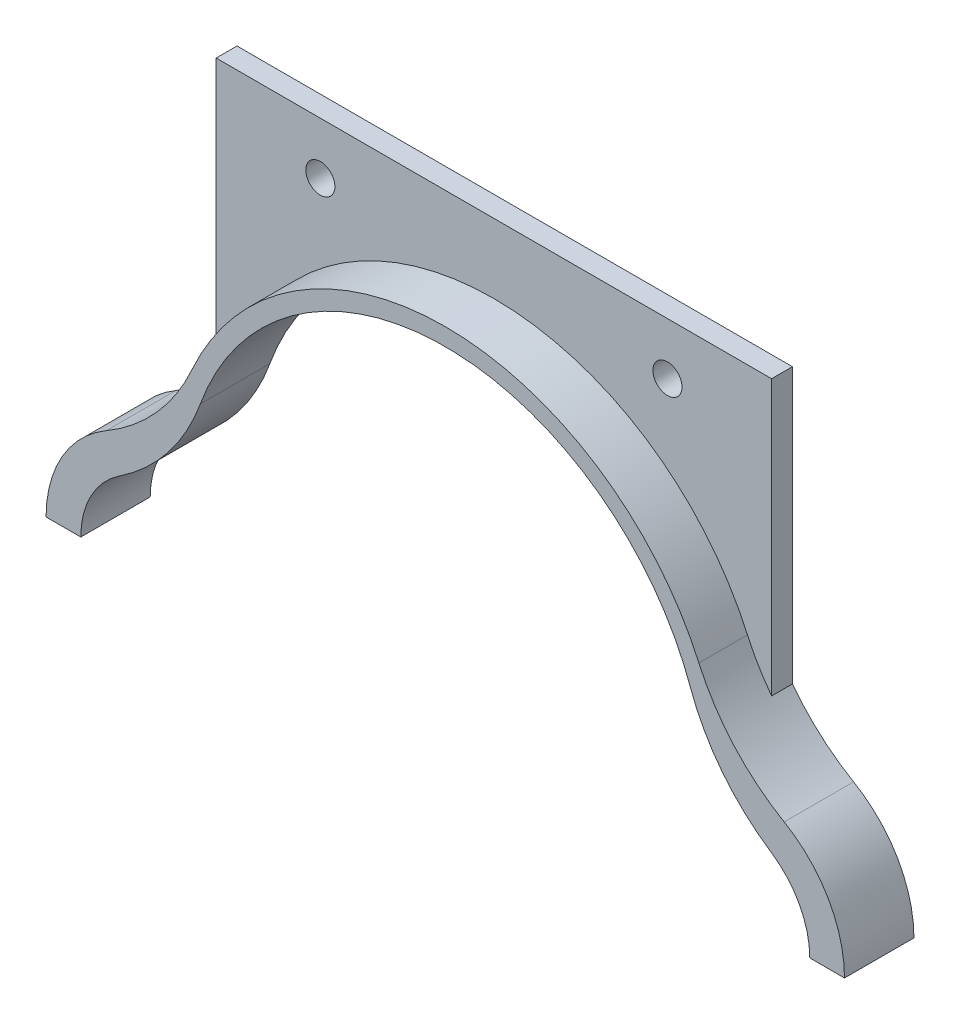
ISO-10303-21;
HEADER;
FILE_DESCRIPTION(('STEP AP214'),'2;1');
FILE_NAME('part.step','',(''),(''),'','','');
FILE_SCHEMA(('AUTOMOTIVE_DESIGN { 1 0 10303 214 1 1 1 1 }'));
ENDSEC;
DATA;
#1=APPLICATION_CONTEXT('core data for automotive mechanical design processes');
#2=APPLICATION_PROTOCOL_DEFINITION('international standard','automotive_design',2000,#1);
#3=PRODUCT_CONTEXT('',#1,'mechanical');
#4=PRODUCT('Part','Part','',(#3));
#5=PRODUCT_RELATED_PRODUCT_CATEGORY('part','',(#4));
#6=PRODUCT_DEFINITION_FORMATION('','',#4);
#7=PRODUCT_DEFINITION_CONTEXT('part definition',#1,'design');
#8=PRODUCT_DEFINITION('design','',#6,#7);
#9=PRODUCT_DEFINITION_SHAPE('','',#8);
#10=(LENGTH_UNIT() NAMED_UNIT(*) SI_UNIT(.MILLI.,.METRE.));
#11=(NAMED_UNIT(*) PLANE_ANGLE_UNIT() SI_UNIT($,.RADIAN.));
#12=(NAMED_UNIT(*) SI_UNIT($,.STERADIAN.) SOLID_ANGLE_UNIT());
#13=UNCERTAINTY_MEASURE_WITH_UNIT(LENGTH_MEASURE(1.E-05),#10,'distance_accuracy_value','');
#14=(GEOMETRIC_REPRESENTATION_CONTEXT(3) GLOBAL_UNCERTAINTY_ASSIGNED_CONTEXT((#13)) GLOBAL_UNIT_ASSIGNED_CONTEXT((#10,
#11,#12)) REPRESENTATION_CONTEXT('',''));
#15=CARTESIAN_POINT('',(0.,0.,0.));
#16=DIRECTION('',(0.,0.,1.));
#17=DIRECTION('',(1.,0.,0.));
#18=AXIS2_PLACEMENT_3D('',#15,#16,#17);
#19=CARTESIAN_POINT('',(0.,0.,10.));
#20=DIRECTION('',(0.,0.,-1.));
#21=DIRECTION('',(-1.,0.,0.));
#22=AXIS2_PLACEMENT_3D('',#19,#20,#21);
#23=CYLINDRICAL_SURFACE('',#22,40.);
#24=CARTESIAN_POINT('',(0.,0.,10.));
#25=DIRECTION('',(0.,0.,1.));
#26=DIRECTION('',(-1.,0.,0.));
#27=AXIS2_PLACEMENT_3D('',#24,#25,#26);
#28=CIRCLE('',#27,40.);
#29=CARTESIAN_POINT('',(36.5247456513778,16.3077575129801,10.));
#30=VERTEX_POINT('',#29);
#31=CARTESIAN_POINT('',(-36.5247456513778,16.3077575129801,10.));
#32=VERTEX_POINT('',#31);
#33=EDGE_CURVE('E236',#30,#32,#28,.T.);
#34=ORIENTED_EDGE('',*,*,#33,.F.);
#35=DIRECTION('',(0.,0.,-1.));
#36=VECTOR('',#35,1.);
#37=CARTESIAN_POINT('',(36.5247456513778,16.3077575129801,10.));
#38=LINE('',#37,#36);
#39=CARTESIAN_POINT('',(36.5247456513777,16.3077575129801,3.));
#40=VERTEX_POINT('',#39);
#41=EDGE_CURVE('E263',#30,#40,#38,.T.);
#42=ORIENTED_EDGE('',*,*,#41,.T.);
#43=CARTESIAN_POINT('',(0.,0.,3.));
#44=DIRECTION('',(0.,0.,1.));
#45=DIRECTION('',(1.,0.,0.));
#46=AXIS2_PLACEMENT_3D('',#43,#44,#45);
#47=CIRCLE('',#46,40.);
#48=CARTESIAN_POINT('',(-36.5247456513777,16.3077575129801,3.));
#49=VERTEX_POINT('',#48);
#50=EDGE_CURVE('E213',#40,#49,#47,.T.);
#51=ORIENTED_EDGE('',*,*,#50,.T.);
#52=DIRECTION('',(0.,0.,-1.));
#53=VECTOR('',#52,1.);
#54=CARTESIAN_POINT('',(-36.5247456513778,16.3077575129801,10.));
#55=LINE('',#54,#53);
#56=EDGE_CURVE('E261',#49,#32,#55,.F.);
#57=ORIENTED_EDGE('',*,*,#56,.T.);
#58=EDGE_LOOP('',(#34,#42,#51,#57));
#59=FACE_BOUND('',#58,.T.);
#60=ADVANCED_FACE('F34',(#59),#23,.T.);
#61=CARTESIAN_POINT('',(-40.,50.,3.));
#62=DIRECTION('',(-1.,0.,0.));
#63=DIRECTION('',(0.,-1.,0.));
#64=AXIS2_PLACEMENT_3D('',#61,#62,#63);
#65=PLANE('',#64);
#66=DIRECTION('',(0.,1.,0.));
#67=VECTOR('',#66,1.);
#68=CARTESIAN_POINT('',(-40.,50.,0.));
#69=LINE('',#68,#67);
#70=CARTESIAN_POINT('',(-40.,10.4301607200289,0.));
#71=VERTEX_POINT('',#70);
#72=CARTESIAN_POINT('',(-40.,50.,0.));
#73=VERTEX_POINT('',#72);
#74=EDGE_CURVE('E204',#71,#73,#69,.T.);
#75=ORIENTED_EDGE('',*,*,#74,.F.);
#76=DIRECTION('',(0.,0.,1.));
#77=VECTOR('',#76,1.);
#78=CARTESIAN_POINT('',(-40.,10.4301607200289,0.));
#79=LINE('',#78,#77);
#80=CARTESIAN_POINT('',(-40.,10.4301607200289,3.));
#81=VERTEX_POINT('',#80);
#82=EDGE_CURVE('E277',#71,#81,#79,.T.);
#83=ORIENTED_EDGE('',*,*,#82,.T.);
#84=DIRECTION('',(0.,1.,0.));
#85=VECTOR('',#84,1.);
#86=CARTESIAN_POINT('',(-40.,50.,3.));
#87=LINE('',#86,#85);
#88=CARTESIAN_POINT('',(-40.,50.,3.));
#89=VERTEX_POINT('',#88);
#90=EDGE_CURVE('E216',#81,#89,#87,.T.);
#91=ORIENTED_EDGE('',*,*,#90,.T.);
#92=DIRECTION('',(0.,0.,-1.));
#93=VECTOR('',#92,1.);
#94=CARTESIAN_POINT('',(-40.,50.,3.));
#95=LINE('',#94,#93);
#96=EDGE_CURVE('E225',#89,#73,#95,.T.);
#97=ORIENTED_EDGE('',*,*,#96,.T.);
#98=EDGE_LOOP('',(#75,#83,#91,#97));
#99=FACE_BOUND('',#98,.T.);
#100=ADVANCED_FACE('F347',(#99),#65,.T.);
#101=CARTESIAN_POINT('',(0.,0.,3.));
#102=DIRECTION('',(0.,0.,1.));
#103=DIRECTION('',(1.,0.,0.));
#104=AXIS2_PLACEMENT_3D('',#101,#102,#103);
#105=PLANE('',#104);
#106=ORIENTED_EDGE('',*,*,#50,.F.);
#107=CARTESIAN_POINT('',(63.9183048899111,28.5385756477153,3.));
#108=DIRECTION('',(0.,0.,1.));
#109=DIRECTION('',(1.,0.,0.));
#110=AXIS2_PLACEMENT_3D('',#107,#108,#109);
#111=CIRCLE('',#110,30.);
#112=CARTESIAN_POINT('',(40.,10.4301607200289,3.));
#113=VERTEX_POINT('',#112);
#114=EDGE_CURVE('E268',#40,#113,#111,.T.);
#115=ORIENTED_EDGE('',*,*,#114,.T.);
#116=DIRECTION('',(0.,-1.,0.));
#117=VECTOR('',#116,1.);
#118=CARTESIAN_POINT('',(40.,-2.79318507107451E-13,3.));
#119=LINE('',#118,#117);
#120=CARTESIAN_POINT('',(40.,50.,3.));
#121=VERTEX_POINT('',#120);
#122=EDGE_CURVE('E222',#121,#113,#119,.T.);
#123=ORIENTED_EDGE('',*,*,#122,.F.);
#124=DIRECTION('',(1.,0.,0.));
#125=VECTOR('',#124,1.);
#126=CARTESIAN_POINT('',(40.,50.,3.));
#127=LINE('',#126,#125);
#128=EDGE_CURVE('E219',#89,#121,#127,.T.);
#129=ORIENTED_EDGE('',*,*,#128,.F.);
#130=ORIENTED_EDGE('',*,*,#90,.F.);
#131=CARTESIAN_POINT('',(-63.9183048899111,28.5385756477153,3.));
#132=DIRECTION('',(0.,0.,1.));
#133=DIRECTION('',(1.,0.,0.));
#134=AXIS2_PLACEMENT_3D('',#131,#132,#133);
#135=CIRCLE('',#134,30.);
#136=EDGE_CURVE('E266',#81,#49,#135,.T.);
#137=ORIENTED_EDGE('',*,*,#136,.T.);
#138=EDGE_LOOP('',(#106,#115,#123,#129,#130,#137));
#139=FACE_BOUND('',#138,.T.);
#140=CARTESIAN_POINT('',(-25.,42.5,3.));
#141=DIRECTION('',(0.,0.,1.));
#142=DIRECTION('',(1.,0.,0.));
#143=AXIS2_PLACEMENT_3D('',#140,#141,#142);
#144=CIRCLE('',#143,2.1);
#145=CARTESIAN_POINT('',(-22.9,42.5,3.));
#146=VERTEX_POINT('',#145);
#147=EDGE_CURVE('E205',#146,#146,#144,.T.);
#148=ORIENTED_EDGE('',*,*,#147,.F.);
#149=EDGE_LOOP('',(#148));
#150=FACE_BOUND('',#149,.T.);
#151=CARTESIAN_POINT('',(25.,42.5,3.));
#152=DIRECTION('',(0.,0.,1.));
#153=DIRECTION('',(1.,0.,0.));
#154=AXIS2_PLACEMENT_3D('',#151,#152,#153);
#155=CIRCLE('',#154,2.1);
#156=CARTESIAN_POINT('',(27.1,42.5,3.));
#157=VERTEX_POINT('',#156);
#158=EDGE_CURVE('E189',#157,#157,#155,.T.);
#159=ORIENTED_EDGE('',*,*,#158,.F.);
#160=EDGE_LOOP('',(#159));
#161=FACE_BOUND('',#160,.T.);
#162=ADVANCED_FACE('F293',(#139,#150,#161),#105,.T.);
#163=CARTESIAN_POINT('',(0.,0.,10.));
#164=DIRECTION('',(0.,0.,-1.));
#165=DIRECTION('',(-1.,0.,0.));
#166=AXIS2_PLACEMENT_3D('',#163,#164,#165);
#167=CYLINDRICAL_SURFACE('',#166,37.5);
#168=CARTESIAN_POINT('',(0.,0.,0.));
#169=DIRECTION('',(0.,0.,-1.));
#170=DIRECTION('',(-1.,0.,0.));
#171=AXIS2_PLACEMENT_3D('',#168,#169,#170);
#172=CIRCLE('',#171,37.5);
#173=CARTESIAN_POINT('',(-35.2722936336884,12.7324507389138,0.));
#174=VERTEX_POINT('',#173);
#175=CARTESIAN_POINT('',(35.2722936336884,12.7324507389138,0.));
#176=VERTEX_POINT('',#175);
#177=EDGE_CURVE('E233',#174,#176,#172,.T.);
#178=ORIENTED_EDGE('',*,*,#177,.T.);
#179=DIRECTION('',(0.,0.,-1.));
#180=VECTOR('',#179,1.);
#181=CARTESIAN_POINT('',(35.2722936336884,12.7324507389138,10.));
#182=LINE('',#181,#180);
#183=CARTESIAN_POINT('',(35.2722936336884,12.7324507389138,10.));
#184=VERTEX_POINT('',#183);
#185=EDGE_CURVE('E253',#176,#184,#182,.F.);
#186=ORIENTED_EDGE('',*,*,#185,.T.);
#187=CARTESIAN_POINT('',(0.,0.,10.));
#188=DIRECTION('',(0.,0.,-1.));
#189=DIRECTION('',(-1.,0.,0.));
#190=AXIS2_PLACEMENT_3D('',#187,#188,#189);
#191=CIRCLE('',#190,37.5);
#192=CARTESIAN_POINT('',(-35.2722936336884,12.7324507389138,10.));
#193=VERTEX_POINT('',#192);
#194=EDGE_CURVE('E238',#193,#184,#191,.T.);
#195=ORIENTED_EDGE('',*,*,#194,.F.);
#196=DIRECTION('',(0.,0.,-1.));
#197=VECTOR('',#196,1.);
#198=CARTESIAN_POINT('',(-35.2722936336884,12.7324507389138,10.));
#199=LINE('',#198,#197);
#200=EDGE_CURVE('E250',#193,#174,#199,.T.);
#201=ORIENTED_EDGE('',*,*,#200,.T.);
#202=EDGE_LOOP('',(#178,#186,#195,#201));
#203=FACE_BOUND('',#202,.T.);
#204=ADVANCED_FACE('F328',(#203),#167,.F.);
#205=CARTESIAN_POINT('',(0.,0.,10.));
#206=DIRECTION('',(0.,0.,-1.));
#207=DIRECTION('',(-1.,0.,0.));
#208=AXIS2_PLACEMENT_3D('',#205,#206,#207);
#209=PLANE('',#208);
#210=ORIENTED_EDGE('',*,*,#194,.T.);
#211=CARTESIAN_POINT('',(63.4901285406391,22.9184113300448,10.));
#212=DIRECTION('',(0.,0.,-1.));
#213=DIRECTION('',(-1.,0.,0.));
#214=AXIS2_PLACEMENT_3D('',#211,#212,#213);
#215=CIRCLE('',#214,30.);
#216=CARTESIAN_POINT('',(46.9088613354821,-2.08282019704569,10.));
#217=VERTEX_POINT('',#216);
#218=EDGE_CURVE('E257',#184,#217,#215,.F.);
#219=ORIENTED_EDGE('',*,*,#218,.T.);
#220=CARTESIAN_POINT('',(40.,-12.5000000000001,10.));
#221=DIRECTION('',(0.,0.,-1.));
#222=DIRECTION('',(-1.,0.,0.));
#223=AXIS2_PLACEMENT_3D('',#220,#221,#222);
#224=CIRCLE('',#223,12.5);
#225=CARTESIAN_POINT('',(52.5,-12.5000000000001,10.));
#226=VERTEX_POINT('',#225);
#227=EDGE_CURVE('E175',#226,#217,#224,.F.);
#228=ORIENTED_EDGE('',*,*,#227,.F.);
#229=DIRECTION('',(1.,0.,0.));
#230=VECTOR('',#229,1.);
#231=CARTESIAN_POINT('',(0.,-12.5000000000001,10.));
#232=LINE('',#231,#230);
#233=CARTESIAN_POINT('',(57.5,-12.5000000000001,10.));
#234=VERTEX_POINT('',#233);
#235=EDGE_CURVE('E177',#226,#234,#232,.T.);
#236=ORIENTED_EDGE('',*,*,#235,.T.);
#237=CARTESIAN_POINT('',(40.,-12.5000000000001,10.));
#238=DIRECTION('',(0.,0.,-1.));
#239=DIRECTION('',(-1.,0.,0.));
#240=AXIS2_PLACEMENT_3D('',#237,#238,#239);
#241=CIRCLE('',#240,17.5);
#242=CARTESIAN_POINT('',(48.8120070647041,2.61947523863189,10.));
#243=VERTEX_POINT('',#242);
#244=EDGE_CURVE('E162',#234,#243,#241,.F.);
#245=ORIENTED_EDGE('',*,*,#244,.T.);
#246=CARTESIAN_POINT('',(63.9183048899111,28.5385756477153,10.));
#247=DIRECTION('',(0.,0.,-1.));
#248=DIRECTION('',(-1.,0.,0.));
#249=AXIS2_PLACEMENT_3D('',#246,#247,#248);
#250=CIRCLE('',#249,30.);
#251=EDGE_CURVE('E280',#243,#30,#250,.T.);
#252=ORIENTED_EDGE('',*,*,#251,.T.);
#253=ORIENTED_EDGE('',*,*,#33,.T.);
#254=CARTESIAN_POINT('',(-63.9183048899111,28.5385756477153,10.));
#255=DIRECTION('',(0.,0.,-1.));
#256=DIRECTION('',(-1.,0.,0.));
#257=AXIS2_PLACEMENT_3D('',#254,#255,#256);
#258=CIRCLE('',#257,30.);
#259=CARTESIAN_POINT('',(-48.8120070647041,2.61947523863189,10.));
#260=VERTEX_POINT('',#259);
#261=EDGE_CURVE('E11',#32,#260,#258,.T.);
#262=ORIENTED_EDGE('',*,*,#261,.T.);
#263=CARTESIAN_POINT('',(-40.,-12.5000000000001,10.));
#264=DIRECTION('',(0.,0.,-1.));
#265=DIRECTION('',(-1.,0.,0.));
#266=AXIS2_PLACEMENT_3D('',#263,#264,#265);
#267=CIRCLE('',#266,17.5);
#268=CARTESIAN_POINT('',(-57.5,-12.5000000000001,10.));
#269=VERTEX_POINT('',#268);
#270=EDGE_CURVE('E187',#269,#260,#267,.T.);
#271=ORIENTED_EDGE('',*,*,#270,.F.);
#272=DIRECTION('',(-1.,0.,0.));
#273=VECTOR('',#272,1.);
#274=CARTESIAN_POINT('',(0.,-12.5000000000001,10.));
#275=LINE('',#274,#273);
#276=CARTESIAN_POINT('',(-52.5,-12.5000000000001,10.));
#277=VERTEX_POINT('',#276);
#278=EDGE_CURVE('E183',#277,#269,#275,.T.);
#279=ORIENTED_EDGE('',*,*,#278,.F.);
#280=CARTESIAN_POINT('',(-40.,-12.5000000000001,10.));
#281=DIRECTION('',(0.,0.,-1.));
#282=DIRECTION('',(-1.,0.,0.));
#283=AXIS2_PLACEMENT_3D('',#280,#281,#282);
#284=CIRCLE('',#283,12.5);
#285=CARTESIAN_POINT('',(-46.9088613354821,-2.08282019704569,10.));
#286=VERTEX_POINT('',#285);
#287=EDGE_CURVE('E180',#277,#286,#284,.T.);
#288=ORIENTED_EDGE('',*,*,#287,.T.);
#289=CARTESIAN_POINT('',(-63.4901285406391,22.9184113300448,10.));
#290=DIRECTION('',(0.,0.,-1.));
#291=DIRECTION('',(-1.,0.,0.));
#292=AXIS2_PLACEMENT_3D('',#289,#290,#291);
#293=CIRCLE('',#292,30.);
#294=EDGE_CURVE('E255',#286,#193,#293,.F.);
#295=ORIENTED_EDGE('',*,*,#294,.T.);
#296=EDGE_LOOP('',(#210,#219,#228,#236,#245,#252,#253,#262,#271,#279,#288,#295));
#297=FACE_BOUND('',#296,.T.);
#298=ADVANCED_FACE('F283',(#297),#209,.F.);
#299=CARTESIAN_POINT('',(0.,0.,0.));
#300=DIRECTION('',(0.,0.,-1.));
#301=DIRECTION('',(-1.,0.,0.));
#302=AXIS2_PLACEMENT_3D('',#299,#300,#301);
#303=PLANE('',#302);
#304=CARTESIAN_POINT('',(40.,-12.5000000000001,0.));
#305=DIRECTION('',(0.,0.,1.));
#306=DIRECTION('',(1.,0.,0.));
#307=AXIS2_PLACEMENT_3D('',#304,#305,#306);
#308=CIRCLE('',#307,12.5);
#309=CARTESIAN_POINT('',(46.9088613354821,-2.08282019704569,0.));
#310=VERTEX_POINT('',#309);
#311=CARTESIAN_POINT('',(52.5,-12.5000000000001,0.));
#312=VERTEX_POINT('',#311);
#313=EDGE_CURVE('E166',#310,#312,#308,.F.);
#314=ORIENTED_EDGE('',*,*,#313,.F.);
#315=CARTESIAN_POINT('',(63.4901285406391,22.9184113300448,0.));
#316=DIRECTION('',(0.,0.,-1.));
#317=DIRECTION('',(-1.,0.,0.));
#318=AXIS2_PLACEMENT_3D('',#315,#316,#317);
#319=CIRCLE('',#318,30.);
#320=EDGE_CURVE('E248',#310,#176,#319,.T.);
#321=ORIENTED_EDGE('',*,*,#320,.T.);
#322=ORIENTED_EDGE('',*,*,#177,.F.);
#323=CARTESIAN_POINT('',(-63.4901285406391,22.9184113300448,0.));
#324=DIRECTION('',(0.,0.,-1.));
#325=DIRECTION('',(-1.,0.,0.));
#326=AXIS2_PLACEMENT_3D('',#323,#324,#325);
#327=CIRCLE('',#326,30.);
#328=CARTESIAN_POINT('',(-46.9088613354821,-2.08282019704569,0.));
#329=VERTEX_POINT('',#328);
#330=EDGE_CURVE('E246',#174,#329,#327,.T.);
#331=ORIENTED_EDGE('',*,*,#330,.T.);
#332=CARTESIAN_POINT('',(-40.,-12.5000000000001,0.));
#333=DIRECTION('',(0.,0.,-1.));
#334=DIRECTION('',(-1.,0.,0.));
#335=AXIS2_PLACEMENT_3D('',#332,#333,#334);
#336=CIRCLE('',#335,12.5);
#337=CARTESIAN_POINT('',(-52.5,-12.5000000000001,0.));
#338=VERTEX_POINT('',#337);
#339=EDGE_CURVE('E191',#329,#338,#336,.F.);
#340=ORIENTED_EDGE('',*,*,#339,.T.);
#341=DIRECTION('',(1.,0.,0.));
#342=VECTOR('',#341,1.);
#343=CARTESIAN_POINT('',(0.,-12.5000000000001,0.));
#344=LINE('',#343,#342);
#345=CARTESIAN_POINT('',(-57.5,-12.5000000000001,0.));
#346=VERTEX_POINT('',#345);
#347=EDGE_CURVE('E193',#346,#338,#344,.T.);
#348=ORIENTED_EDGE('',*,*,#347,.F.);
#349=CARTESIAN_POINT('',(-40.,-12.5000000000001,0.));
#350=DIRECTION('',(0.,0.,-1.));
#351=DIRECTION('',(-1.,0.,0.));
#352=AXIS2_PLACEMENT_3D('',#349,#350,#351);
#353=CIRCLE('',#352,17.5);
#354=CARTESIAN_POINT('',(-48.8120070647041,2.61947523863189,0.));
#355=VERTEX_POINT('',#354);
#356=EDGE_CURVE('E179',#355,#346,#353,.F.);
#357=ORIENTED_EDGE('',*,*,#356,.F.);
#358=CARTESIAN_POINT('',(-63.9183048899111,28.5385756477153,0.));
#359=DIRECTION('',(0.,0.,-1.));
#360=DIRECTION('',(-1.,0.,0.));
#361=AXIS2_PLACEMENT_3D('',#358,#359,#360);
#362=CIRCLE('',#361,30.);
#363=EDGE_CURVE('E42',#355,#71,#362,.F.);
#364=ORIENTED_EDGE('',*,*,#363,.T.);
#365=ORIENTED_EDGE('',*,*,#74,.T.);
#366=DIRECTION('',(1.,0.,0.));
#367=VECTOR('',#366,1.);
#368=CARTESIAN_POINT('',(40.,50.,0.));
#369=LINE('',#368,#367);
#370=CARTESIAN_POINT('',(40.,50.,0.));
#371=VERTEX_POINT('',#370);
#372=EDGE_CURVE('E227',#73,#371,#369,.T.);
#373=ORIENTED_EDGE('',*,*,#372,.T.);
#374=DIRECTION('',(0.,-1.,0.));
#375=VECTOR('',#374,1.);
#376=CARTESIAN_POINT('',(40.,-2.79318507107451E-13,0.));
#377=LINE('',#376,#375);
#378=CARTESIAN_POINT('',(40.,10.4301607200289,0.));
#379=VERTEX_POINT('',#378);
#380=EDGE_CURVE('E217',#371,#379,#377,.T.);
#381=ORIENTED_EDGE('',*,*,#380,.T.);
#382=CARTESIAN_POINT('',(63.9183048899111,28.5385756477153,0.));
#383=DIRECTION('',(0.,0.,-1.));
#384=DIRECTION('',(-1.,0.,0.));
#385=AXIS2_PLACEMENT_3D('',#382,#383,#384);
#386=CIRCLE('',#385,30.);
#387=CARTESIAN_POINT('',(48.8120070647041,2.61947523863189,0.));
#388=VERTEX_POINT('',#387);
#389=EDGE_CURVE('E153',#379,#388,#386,.F.);
#390=ORIENTED_EDGE('',*,*,#389,.T.);
#391=CARTESIAN_POINT('',(40.,-12.5000000000001,0.));
#392=DIRECTION('',(0.,0.,1.));
#393=DIRECTION('',(1.,0.,0.));
#394=AXIS2_PLACEMENT_3D('',#391,#392,#393);
#395=CIRCLE('',#394,17.5);
#396=CARTESIAN_POINT('',(57.5,-12.5000000000001,0.));
#397=VERTEX_POINT('',#396);
#398=EDGE_CURVE('E144',#388,#397,#395,.F.);
#399=ORIENTED_EDGE('',*,*,#398,.T.);
#400=DIRECTION('',(-1.,0.,0.));
#401=VECTOR('',#400,1.);
#402=CARTESIAN_POINT('',(0.,-12.5000000000001,0.));
#403=LINE('',#402,#401);
#404=EDGE_CURVE('E150',#397,#312,#403,.T.);
#405=ORIENTED_EDGE('',*,*,#404,.T.);
#406=EDGE_LOOP('',(#314,#321,#322,#331,#340,#348,#357,#364,#365,#373,#381,#390,#399,#405));
#407=FACE_BOUND('',#406,.T.);
#408=CARTESIAN_POINT('',(-25.,42.5,0.));
#409=DIRECTION('',(0.,0.,1.));
#410=DIRECTION('',(1.,0.,0.));
#411=AXIS2_PLACEMENT_3D('',#408,#409,#410);
#412=CIRCLE('',#411,2.1);
#413=CARTESIAN_POINT('',(-22.9,42.5,0.));
#414=VERTEX_POINT('',#413);
#415=EDGE_CURVE('E201',#414,#414,#412,.T.);
#416=ORIENTED_EDGE('',*,*,#415,.T.);
#417=EDGE_LOOP('',(#416));
#418=FACE_BOUND('',#417,.T.);
#419=CARTESIAN_POINT('',(25.,42.5,0.));
#420=DIRECTION('',(0.,0.,1.));
#421=DIRECTION('',(1.,0.,0.));
#422=AXIS2_PLACEMENT_3D('',#419,#420,#421);
#423=CIRCLE('',#422,2.1);
#424=CARTESIAN_POINT('',(27.1,42.5,0.));
#425=VERTEX_POINT('',#424);
#426=EDGE_CURVE('E208',#425,#425,#423,.T.);
#427=ORIENTED_EDGE('',*,*,#426,.T.);
#428=EDGE_LOOP('',(#427));
#429=FACE_BOUND('',#428,.T.);
#430=ADVANCED_FACE('F147',(#407,#418,#429),#303,.T.);
#431=CARTESIAN_POINT('',(40.,-2.79318507107451E-13,3.));
#432=DIRECTION('',(1.,0.,0.));
#433=DIRECTION('',(0.,1.,0.));
#434=AXIS2_PLACEMENT_3D('',#431,#432,#433);
#435=PLANE('',#434);
#436=ORIENTED_EDGE('',*,*,#122,.T.);
#437=DIRECTION('',(0.,0.,1.));
#438=VECTOR('',#437,1.);
#439=CARTESIAN_POINT('',(40.,10.4301607200289,3.));
#440=LINE('',#439,#438);
#441=EDGE_CURVE('E270',#113,#379,#440,.F.);
#442=ORIENTED_EDGE('',*,*,#441,.T.);
#443=ORIENTED_EDGE('',*,*,#380,.F.);
#444=DIRECTION('',(0.,0.,-1.));
#445=VECTOR('',#444,1.);
#446=CARTESIAN_POINT('',(40.,50.,3.));
#447=LINE('',#446,#445);
#448=EDGE_CURVE('E231',#121,#371,#447,.T.);
#449=ORIENTED_EDGE('',*,*,#448,.F.);
#450=EDGE_LOOP('',(#436,#442,#443,#449));
#451=FACE_BOUND('',#450,.T.);
#452=ADVANCED_FACE('F297',(#451),#435,.T.);
#453=CARTESIAN_POINT('',(40.,50.,3.));
#454=DIRECTION('',(0.,1.,0.));
#455=DIRECTION('',(0.,0.,1.));
#456=AXIS2_PLACEMENT_3D('',#453,#454,#455);
#457=PLANE('',#456);
#458=ORIENTED_EDGE('',*,*,#372,.F.);
#459=ORIENTED_EDGE('',*,*,#96,.F.);
#460=ORIENTED_EDGE('',*,*,#128,.T.);
#461=ORIENTED_EDGE('',*,*,#448,.T.);
#462=EDGE_LOOP('',(#458,#459,#460,#461));
#463=FACE_BOUND('',#462,.T.);
#464=ADVANCED_FACE('F302',(#463),#457,.T.);
#465=CARTESIAN_POINT('',(25.,42.5,0.));
#466=DIRECTION('',(0.,0.,1.));
#467=DIRECTION('',(1.,0.,0.));
#468=AXIS2_PLACEMENT_3D('',#465,#466,#467);
#469=CYLINDRICAL_SURFACE('',#468,2.1);
#470=ORIENTED_EDGE('',*,*,#426,.F.);
#471=EDGE_LOOP('',(#470));
#472=FACE_BOUND('',#471,.T.);
#473=ORIENTED_EDGE('',*,*,#158,.T.);
#474=EDGE_LOOP('',(#473));
#475=FACE_BOUND('',#474,.T.);
#476=ADVANCED_FACE('F486',(#472,#475),#469,.F.);
#477=CARTESIAN_POINT('',(-25.,42.5,0.));
#478=DIRECTION('',(0.,0.,1.));
#479=DIRECTION('',(1.,0.,0.));
#480=AXIS2_PLACEMENT_3D('',#477,#478,#479);
#481=CYLINDRICAL_SURFACE('',#480,2.1);
#482=ORIENTED_EDGE('',*,*,#415,.F.);
#483=EDGE_LOOP('',(#482));
#484=FACE_BOUND('',#483,.T.);
#485=ORIENTED_EDGE('',*,*,#147,.T.);
#486=EDGE_LOOP('',(#485));
#487=FACE_BOUND('',#486,.T.);
#488=ADVANCED_FACE('F388',(#484,#487),#481,.F.);
#489=CARTESIAN_POINT('',(-40.,-12.5000000000001,34.9713114719915));
#490=DIRECTION('',(0.,0.,-1.));
#491=DIRECTION('',(-1.,0.,0.));
#492=AXIS2_PLACEMENT_3D('',#489,#490,#491);
#493=CYLINDRICAL_SURFACE('',#492,17.5);
#494=ORIENTED_EDGE('',*,*,#270,.T.);
#495=DIRECTION('',(0.,0.,-1.));
#496=VECTOR('',#495,1.);
#497=CARTESIAN_POINT('',(-48.8120070647041,2.61947523863189,34.9713114719915));
#498=LINE('',#497,#496);
#499=EDGE_CURVE('E274',#260,#355,#498,.T.);
#500=ORIENTED_EDGE('',*,*,#499,.T.);
#501=ORIENTED_EDGE('',*,*,#356,.T.);
#502=DIRECTION('',(0.,0.,-1.));
#503=VECTOR('',#502,1.);
#504=CARTESIAN_POINT('',(-57.5,-12.5000000000001,34.9713114719915));
#505=LINE('',#504,#503);
#506=EDGE_CURVE('E184',#269,#346,#505,.T.);
#507=ORIENTED_EDGE('',*,*,#506,.F.);
#508=EDGE_LOOP('',(#494,#500,#501,#507));
#509=FACE_BOUND('',#508,.T.);
#510=ADVANCED_FACE('F310',(#509),#493,.T.);
#511=CARTESIAN_POINT('',(0.,-12.5000000000001,34.9713114719915));
#512=DIRECTION('',(0.,1.,0.));
#513=DIRECTION('',(0.,0.,1.));
#514=AXIS2_PLACEMENT_3D('',#511,#512,#513);
#515=PLANE('',#514);
#516=DIRECTION('',(0.,0.,-1.));
#517=VECTOR('',#516,1.);
#518=CARTESIAN_POINT('',(-52.5,-12.5000000000001,34.9713114719915));
#519=LINE('',#518,#517);
#520=EDGE_CURVE('E196',#277,#338,#519,.T.);
#521=ORIENTED_EDGE('',*,*,#520,.F.);
#522=ORIENTED_EDGE('',*,*,#278,.T.);
#523=ORIENTED_EDGE('',*,*,#506,.T.);
#524=ORIENTED_EDGE('',*,*,#347,.T.);
#525=EDGE_LOOP('',(#521,#522,#523,#524));
#526=FACE_BOUND('',#525,.T.);
#527=ADVANCED_FACE('F316',(#526),#515,.F.);
#528=CARTESIAN_POINT('',(-40.,-12.5000000000001,34.9713114719915));
#529=DIRECTION('',(0.,0.,-1.));
#530=DIRECTION('',(-1.,0.,0.));
#531=AXIS2_PLACEMENT_3D('',#528,#529,#530);
#532=CYLINDRICAL_SURFACE('',#531,12.5);
#533=ORIENTED_EDGE('',*,*,#339,.F.);
#534=DIRECTION('',(0.,0.,-1.));
#535=VECTOR('',#534,1.);
#536=CARTESIAN_POINT('',(-46.9088613354821,-2.08282019704569,34.9713114719915));
#537=LINE('',#536,#535);
#538=EDGE_CURVE('E259',#329,#286,#537,.F.);
#539=ORIENTED_EDGE('',*,*,#538,.T.);
#540=ORIENTED_EDGE('',*,*,#287,.F.);
#541=ORIENTED_EDGE('',*,*,#520,.T.);
#542=EDGE_LOOP('',(#533,#539,#540,#541));
#543=FACE_BOUND('',#542,.T.);
#544=ADVANCED_FACE('F320',(#543),#532,.F.);
#545=CARTESIAN_POINT('',(40.,-12.5000000000001,34.9713114719915));
#546=DIRECTION('',(0.,0.,-1.));
#547=DIRECTION('',(-1.,0.,0.));
#548=AXIS2_PLACEMENT_3D('',#545,#546,#547);
#549=CYLINDRICAL_SURFACE('',#548,17.5);
#550=ORIENTED_EDGE('',*,*,#398,.F.);
#551=DIRECTION('',(0.,0.,-1.));
#552=VECTOR('',#551,1.);
#553=CARTESIAN_POINT('',(48.8120070647041,2.61947523863189,34.9713114719915));
#554=LINE('',#553,#552);
#555=EDGE_CURVE('E272',#388,#243,#554,.F.);
#556=ORIENTED_EDGE('',*,*,#555,.T.);
#557=ORIENTED_EDGE('',*,*,#244,.F.);
#558=DIRECTION('',(0.,0.,-1.));
#559=VECTOR('',#558,1.);
#560=CARTESIAN_POINT('',(57.5,-12.5000000000001,34.9713114719915));
#561=LINE('',#560,#559);
#562=EDGE_CURVE('E159',#234,#397,#561,.T.);
#563=ORIENTED_EDGE('',*,*,#562,.T.);
#564=EDGE_LOOP('',(#550,#556,#557,#563));
#565=FACE_BOUND('',#564,.T.);
#566=ADVANCED_FACE('F160',(#565),#549,.T.);
#567=CARTESIAN_POINT('',(40.,-12.5000000000001,34.9713114719915));
#568=DIRECTION('',(0.,0.,-1.));
#569=DIRECTION('',(-1.,0.,0.));
#570=AXIS2_PLACEMENT_3D('',#567,#568,#569);
#571=CYLINDRICAL_SURFACE('',#570,12.5);
#572=ORIENTED_EDGE('',*,*,#227,.T.);
#573=DIRECTION('',(0.,0.,-1.));
#574=VECTOR('',#573,1.);
#575=CARTESIAN_POINT('',(46.9088613354821,-2.08282019704569,34.9713114719915));
#576=LINE('',#575,#574);
#577=EDGE_CURVE('E241',#217,#310,#576,.T.);
#578=ORIENTED_EDGE('',*,*,#577,.T.);
#579=ORIENTED_EDGE('',*,*,#313,.T.);
#580=DIRECTION('',(0.,0.,-1.));
#581=VECTOR('',#580,1.);
#582=CARTESIAN_POINT('',(52.5,-12.5000000000001,34.9713114719915));
#583=LINE('',#582,#581);
#584=EDGE_CURVE('E165',#226,#312,#583,.T.);
#585=ORIENTED_EDGE('',*,*,#584,.F.);
#586=EDGE_LOOP('',(#572,#578,#579,#585));
#587=FACE_BOUND('',#586,.T.);
#588=ADVANCED_FACE('F336',(#587),#571,.F.);
#589=CARTESIAN_POINT('',(0.,-12.5000000000001,34.9713114719915));
#590=DIRECTION('',(0.,-1.,0.));
#591=DIRECTION('',(0.,0.,-1.));
#592=AXIS2_PLACEMENT_3D('',#589,#590,#591);
#593=PLANE('',#592);
#594=ORIENTED_EDGE('',*,*,#235,.F.);
#595=ORIENTED_EDGE('',*,*,#584,.T.);
#596=ORIENTED_EDGE('',*,*,#404,.F.);
#597=ORIENTED_EDGE('',*,*,#562,.F.);
#598=EDGE_LOOP('',(#594,#595,#596,#597));
#599=FACE_BOUND('',#598,.T.);
#600=ADVANCED_FACE('F169',(#599),#593,.T.);
#601=CARTESIAN_POINT('',(63.4901285406391,22.9184113300448,10.));
#602=DIRECTION('',(0.,0.,-1.));
#603=DIRECTION('',(-1.,0.,0.));
#604=AXIS2_PLACEMENT_3D('',#601,#602,#603);
#605=CYLINDRICAL_SURFACE('',#604,30.);
#606=ORIENTED_EDGE('',*,*,#218,.F.);
#607=ORIENTED_EDGE('',*,*,#185,.F.);
#608=ORIENTED_EDGE('',*,*,#320,.F.);
#609=ORIENTED_EDGE('',*,*,#577,.F.);
#610=EDGE_LOOP('',(#606,#607,#608,#609));
#611=FACE_BOUND('',#610,.T.);
#612=ADVANCED_FACE('F332',(#611),#605,.T.);
#613=CARTESIAN_POINT('',(-63.4901285406391,22.9184113300448,34.9713114719915));
#614=DIRECTION('',(0.,0.,-1.));
#615=DIRECTION('',(-1.,0.,0.));
#616=AXIS2_PLACEMENT_3D('',#613,#614,#615);
#617=CYLINDRICAL_SURFACE('',#616,30.);
#618=ORIENTED_EDGE('',*,*,#294,.F.);
#619=ORIENTED_EDGE('',*,*,#538,.F.);
#620=ORIENTED_EDGE('',*,*,#330,.F.);
#621=ORIENTED_EDGE('',*,*,#200,.F.);
#622=EDGE_LOOP('',(#618,#619,#620,#621));
#623=FACE_BOUND('',#622,.T.);
#624=ADVANCED_FACE('F323',(#623),#617,.T.);
#625=CARTESIAN_POINT('',(63.9183048899111,28.5385756477153,34.9713114719915));
#626=DIRECTION('',(0.,0.,1.));
#627=DIRECTION('',(1.,0.,0.));
#628=AXIS2_PLACEMENT_3D('',#625,#626,#627);
#629=CYLINDRICAL_SURFACE('',#628,30.);
#630=ORIENTED_EDGE('',*,*,#251,.F.);
#631=ORIENTED_EDGE('',*,*,#555,.F.);
#632=ORIENTED_EDGE('',*,*,#389,.F.);
#633=ORIENTED_EDGE('',*,*,#441,.F.);
#634=ORIENTED_EDGE('',*,*,#114,.F.);
#635=ORIENTED_EDGE('',*,*,#41,.F.);
#636=EDGE_LOOP('',(#630,#631,#632,#633,#634,#635));
#637=FACE_BOUND('',#636,.T.);
#638=ADVANCED_FACE('F289',(#637),#629,.F.);
#639=CARTESIAN_POINT('',(-63.9183048899111,28.5385756477153,10.));
#640=DIRECTION('',(0.,0.,1.));
#641=DIRECTION('',(1.,0.,0.));
#642=AXIS2_PLACEMENT_3D('',#639,#640,#641);
#643=CYLINDRICAL_SURFACE('',#642,30.);
#644=ORIENTED_EDGE('',*,*,#261,.F.);
#645=ORIENTED_EDGE('',*,*,#56,.F.);
#646=ORIENTED_EDGE('',*,*,#136,.F.);
#647=ORIENTED_EDGE('',*,*,#82,.F.);
#648=ORIENTED_EDGE('',*,*,#363,.F.);
#649=ORIENTED_EDGE('',*,*,#499,.F.);
#650=EDGE_LOOP('',(#644,#645,#646,#647,#648,#649));
#651=FACE_BOUND('',#650,.T.);
#652=ADVANCED_FACE('F36',(#651),#643,.F.);
#653=CLOSED_SHELL('',(#60,#100,#162,#204,#298,#430,#452,#464,#476,#488,#510,#527,#544,#566,#588,
#600,#612,#624,#638,#652));
#654=MANIFOLD_SOLID_BREP('B2',#653);
#655=ADVANCED_BREP_SHAPE_REPRESENTATION('',(#18,#654),#14);
#656=SHAPE_DEFINITION_REPRESENTATION(#9,#655);
ENDSEC;
END-ISO-10303-21;
